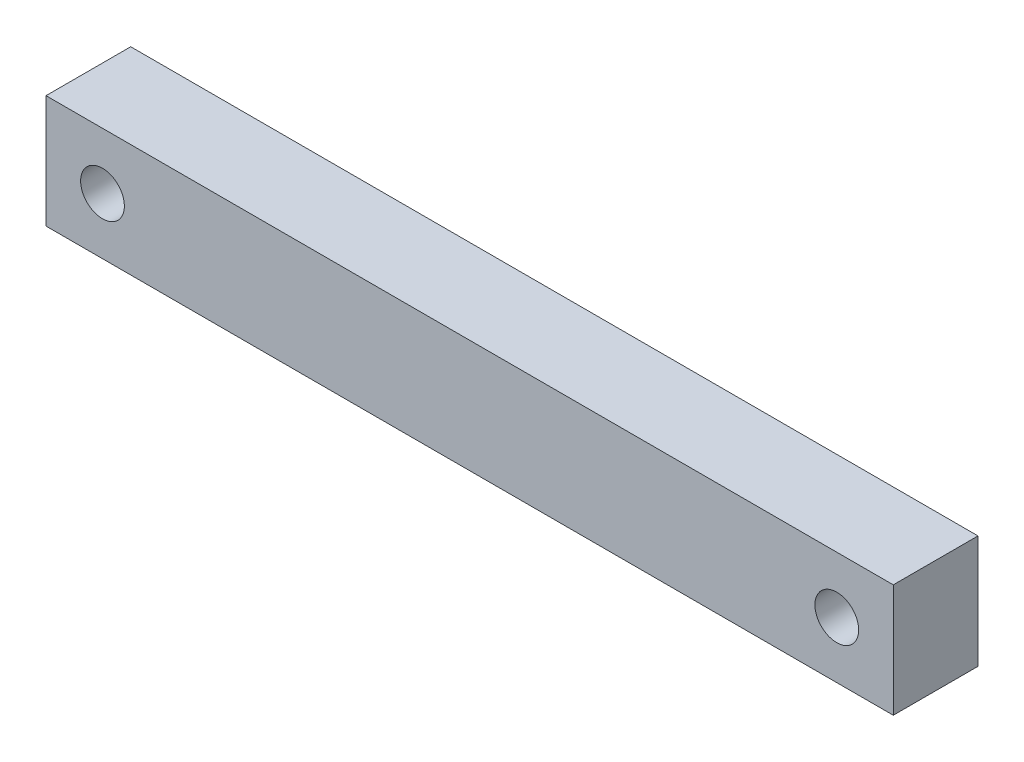
ISO-10303-21;
HEADER;
FILE_DESCRIPTION(('STEP AP214'),'2;1');
FILE_NAME('part.step','',(''),(''),'','','');
FILE_SCHEMA(('AUTOMOTIVE_DESIGN { 1 0 10303 214 1 1 1 1 }'));
ENDSEC;
DATA;
#1=APPLICATION_CONTEXT('core data for automotive mechanical design processes');
#2=APPLICATION_PROTOCOL_DEFINITION('international standard','automotive_design',2000,#1);
#3=PRODUCT_CONTEXT('',#1,'mechanical');
#4=PRODUCT('Part','Part','',(#3));
#5=PRODUCT_RELATED_PRODUCT_CATEGORY('part','',(#4));
#6=PRODUCT_DEFINITION_FORMATION('','',#4);
#7=PRODUCT_DEFINITION_CONTEXT('part definition',#1,'design');
#8=PRODUCT_DEFINITION('design','',#6,#7);
#9=PRODUCT_DEFINITION_SHAPE('','',#8);
#10=(LENGTH_UNIT() NAMED_UNIT(*) SI_UNIT(.MILLI.,.METRE.));
#11=(NAMED_UNIT(*) PLANE_ANGLE_UNIT() SI_UNIT($,.RADIAN.));
#12=(NAMED_UNIT(*) SI_UNIT($,.STERADIAN.) SOLID_ANGLE_UNIT());
#13=UNCERTAINTY_MEASURE_WITH_UNIT(LENGTH_MEASURE(1.E-05),#10,'distance_accuracy_value','');
#14=(GEOMETRIC_REPRESENTATION_CONTEXT(3) GLOBAL_UNCERTAINTY_ASSIGNED_CONTEXT((#13)) GLOBAL_UNIT_ASSIGNED_CONTEXT((#10,
#11,#12)) REPRESENTATION_CONTEXT('',''));
#15=CARTESIAN_POINT('',(0.,0.,0.));
#16=DIRECTION('',(0.,0.,1.));
#17=DIRECTION('',(1.,0.,0.));
#18=AXIS2_PLACEMENT_3D('',#15,#16,#17);
#19=CARTESIAN_POINT('',(0.,0.,6.));
#20=DIRECTION('',(0.,0.,-1.));
#21=DIRECTION('',(-1.,0.,0.));
#22=AXIS2_PLACEMENT_3D('',#19,#20,#21);
#23=PLANE('',#22);
#24=CARTESIAN_POINT('',(85.,-175.103962955716,6.));
#25=DIRECTION('',(0.,0.,1.));
#26=DIRECTION('',(1.,0.,0.));
#27=AXIS2_PLACEMENT_3D('',#24,#25,#26);
#28=CIRCLE('',#27,1.54999999999999);
#29=CARTESIAN_POINT('',(86.55,-175.103962955716,6.));
#30=VERTEX_POINT('',#29);
#31=EDGE_CURVE('E102',#30,#30,#28,.T.);
#32=ORIENTED_EDGE('',*,*,#31,.F.);
#33=EDGE_LOOP('',(#32));
#34=FACE_BOUND('',#33,.T.);
#35=DIRECTION('',(-1.,0.,0.));
#36=VECTOR('',#35,1.);
#37=CARTESIAN_POINT('',(28.9999999999999,-171.103962955716,6.));
#38=LINE('',#37,#36);
#39=CARTESIAN_POINT('',(89.,-171.103962955716,6.));
#40=VERTEX_POINT('',#39);
#41=CARTESIAN_POINT('',(28.9999999999999,-171.103962955716,6.));
#42=VERTEX_POINT('',#41);
#43=EDGE_CURVE('E87',#40,#42,#38,.T.);
#44=ORIENTED_EDGE('',*,*,#43,.T.);
#45=DIRECTION('',(0.,-1.,0.));
#46=VECTOR('',#45,1.);
#47=CARTESIAN_POINT('',(28.9999999999999,-171.103962955716,6.));
#48=LINE('',#47,#46);
#49=CARTESIAN_POINT('',(28.9999999999999,-179.103962955716,6.));
#50=VERTEX_POINT('',#49);
#51=EDGE_CURVE('E82',#42,#50,#48,.T.);
#52=ORIENTED_EDGE('',*,*,#51,.T.);
#53=DIRECTION('',(1.,0.,0.));
#54=VECTOR('',#53,1.);
#55=CARTESIAN_POINT('',(28.9999999999999,-179.103962955716,6.));
#56=LINE('',#55,#54);
#57=CARTESIAN_POINT('',(89.,-179.103962955716,6.));
#58=VERTEX_POINT('',#57);
#59=EDGE_CURVE('E85',#50,#58,#56,.T.);
#60=ORIENTED_EDGE('',*,*,#59,.T.);
#61=DIRECTION('',(0.,1.,0.));
#62=VECTOR('',#61,1.);
#63=CARTESIAN_POINT('',(89.,-171.103962955716,6.));
#64=LINE('',#63,#62);
#65=EDGE_CURVE('E52',#58,#40,#64,.T.);
#66=ORIENTED_EDGE('',*,*,#65,.T.);
#67=EDGE_LOOP('',(#44,#52,#60,#66));
#68=FACE_BOUND('',#67,.T.);
#69=CARTESIAN_POINT('',(32.9999999999999,-175.103962955716,6.));
#70=DIRECTION('',(0.,0.,1.));
#71=DIRECTION('',(1.,0.,0.));
#72=AXIS2_PLACEMENT_3D('',#69,#70,#71);
#73=CIRCLE('',#72,1.55);
#74=CARTESIAN_POINT('',(34.5499999999999,-175.103962955716,6.));
#75=VERTEX_POINT('',#74);
#76=EDGE_CURVE('E117',#75,#75,#73,.T.);
#77=ORIENTED_EDGE('',*,*,#76,.F.);
#78=EDGE_LOOP('',(#77));
#79=FACE_BOUND('',#78,.T.);
#80=ADVANCED_FACE('F35',(#34,#68,#79),#23,.F.);
#81=CARTESIAN_POINT('',(0.,0.,0.));
#82=DIRECTION('',(0.,0.,-1.));
#83=DIRECTION('',(-1.,0.,0.));
#84=AXIS2_PLACEMENT_3D('',#81,#82,#83);
#85=PLANE('',#84);
#86=CARTESIAN_POINT('',(85.,-175.103962955716,0.));
#87=DIRECTION('',(0.,0.,1.));
#88=DIRECTION('',(1.,0.,0.));
#89=AXIS2_PLACEMENT_3D('',#86,#87,#88);
#90=CIRCLE('',#89,1.54999999999999);
#91=CARTESIAN_POINT('',(86.55,-175.103962955716,0.));
#92=VERTEX_POINT('',#91);
#93=EDGE_CURVE('E114',#92,#92,#90,.T.);
#94=ORIENTED_EDGE('',*,*,#93,.T.);
#95=EDGE_LOOP('',(#94));
#96=FACE_BOUND('',#95,.T.);
#97=DIRECTION('',(-1.,0.,0.));
#98=VECTOR('',#97,1.);
#99=CARTESIAN_POINT('',(28.9999999999999,-171.103962955716,0.));
#100=LINE('',#99,#98);
#101=CARTESIAN_POINT('',(89.,-171.103962955716,0.));
#102=VERTEX_POINT('',#101);
#103=CARTESIAN_POINT('',(28.9999999999999,-171.103962955716,0.));
#104=VERTEX_POINT('',#103);
#105=EDGE_CURVE('E99',#102,#104,#100,.T.);
#106=ORIENTED_EDGE('',*,*,#105,.F.);
#107=DIRECTION('',(0.,1.,0.));
#108=VECTOR('',#107,1.);
#109=CARTESIAN_POINT('',(89.,-171.103962955716,0.));
#110=LINE('',#109,#108);
#111=CARTESIAN_POINT('',(89.,-179.103962955716,0.));
#112=VERTEX_POINT('',#111);
#113=EDGE_CURVE('E75',#112,#102,#110,.T.);
#114=ORIENTED_EDGE('',*,*,#113,.F.);
#115=DIRECTION('',(1.,0.,0.));
#116=VECTOR('',#115,1.);
#117=CARTESIAN_POINT('',(28.9999999999999,-179.103962955716,0.));
#118=LINE('',#117,#116);
#119=CARTESIAN_POINT('',(28.9999999999999,-179.103962955716,0.));
#120=VERTEX_POINT('',#119);
#121=EDGE_CURVE('E69',#120,#112,#118,.T.);
#122=ORIENTED_EDGE('',*,*,#121,.F.);
#123=DIRECTION('',(0.,-1.,0.));
#124=VECTOR('',#123,1.);
#125=CARTESIAN_POINT('',(28.9999999999999,-171.103962955716,0.));
#126=LINE('',#125,#124);
#127=EDGE_CURVE('E91',#104,#120,#126,.T.);
#128=ORIENTED_EDGE('',*,*,#127,.F.);
#129=EDGE_LOOP('',(#106,#114,#122,#128));
#130=FACE_BOUND('',#129,.T.);
#131=CARTESIAN_POINT('',(32.9999999999999,-175.103962955716,0.));
#132=DIRECTION('',(0.,0.,1.));
#133=DIRECTION('',(1.,0.,0.));
#134=AXIS2_PLACEMENT_3D('',#131,#132,#133);
#135=CIRCLE('',#134,1.55);
#136=CARTESIAN_POINT('',(34.5499999999999,-175.103962955716,0.));
#137=VERTEX_POINT('',#136);
#138=EDGE_CURVE('E120',#137,#137,#135,.T.);
#139=ORIENTED_EDGE('',*,*,#138,.T.);
#140=EDGE_LOOP('',(#139));
#141=FACE_BOUND('',#140,.T.);
#142=ADVANCED_FACE('F110',(#96,#130,#141),#85,.T.);
#143=CARTESIAN_POINT('',(28.9999999999999,-171.103962955716,6.));
#144=DIRECTION('',(0.,-1.,0.));
#145=DIRECTION('',(1.,0.,0.));
#146=AXIS2_PLACEMENT_3D('',#143,#144,#145);
#147=PLANE('',#146);
#148=ORIENTED_EDGE('',*,*,#105,.T.);
#149=DIRECTION('',(0.,0.,-1.));
#150=VECTOR('',#149,1.);
#151=CARTESIAN_POINT('',(28.9999999999999,-171.103962955716,6.));
#152=LINE('',#151,#150);
#153=EDGE_CURVE('E11',#42,#104,#152,.T.);
#154=ORIENTED_EDGE('',*,*,#153,.F.);
#155=ORIENTED_EDGE('',*,*,#43,.F.);
#156=DIRECTION('',(0.,0.,-1.));
#157=VECTOR('',#156,1.);
#158=CARTESIAN_POINT('',(89.,-171.103962955716,6.));
#159=LINE('',#158,#157);
#160=EDGE_CURVE('E95',#40,#102,#159,.T.);
#161=ORIENTED_EDGE('',*,*,#160,.T.);
#162=EDGE_LOOP('',(#148,#154,#155,#161));
#163=FACE_BOUND('',#162,.T.);
#164=ADVANCED_FACE('F37',(#163),#147,.F.);
#165=CARTESIAN_POINT('',(28.9999999999999,-171.103962955716,6.));
#166=DIRECTION('',(1.,0.,0.));
#167=DIRECTION('',(0.,0.,-1.));
#168=AXIS2_PLACEMENT_3D('',#165,#166,#167);
#169=PLANE('',#168);
#170=ORIENTED_EDGE('',*,*,#127,.T.);
#171=DIRECTION('',(0.,0.,-1.));
#172=VECTOR('',#171,1.);
#173=CARTESIAN_POINT('',(28.9999999999999,-179.103962955716,6.));
#174=LINE('',#173,#172);
#175=EDGE_CURVE('E44',#50,#120,#174,.T.);
#176=ORIENTED_EDGE('',*,*,#175,.F.);
#177=ORIENTED_EDGE('',*,*,#51,.F.);
#178=ORIENTED_EDGE('',*,*,#153,.T.);
#179=EDGE_LOOP('',(#170,#176,#177,#178));
#180=FACE_BOUND('',#179,.T.);
#181=ADVANCED_FACE('F90',(#180),#169,.F.);
#182=CARTESIAN_POINT('',(28.9999999999999,-179.103962955716,6.));
#183=DIRECTION('',(0.,1.,0.));
#184=DIRECTION('',(-1.,0.,0.));
#185=AXIS2_PLACEMENT_3D('',#182,#183,#184);
#186=PLANE('',#185);
#187=ORIENTED_EDGE('',*,*,#121,.T.);
#188=DIRECTION('',(0.,0.,-1.));
#189=VECTOR('',#188,1.);
#190=CARTESIAN_POINT('',(89.,-179.103962955716,6.));
#191=LINE('',#190,#189);
#192=EDGE_CURVE('E92',#58,#112,#191,.T.);
#193=ORIENTED_EDGE('',*,*,#192,.F.);
#194=ORIENTED_EDGE('',*,*,#59,.F.);
#195=ORIENTED_EDGE('',*,*,#175,.T.);
#196=EDGE_LOOP('',(#187,#193,#194,#195));
#197=FACE_BOUND('',#196,.T.);
#198=ADVANCED_FACE('F93',(#197),#186,.F.);
#199=CARTESIAN_POINT('',(89.,-171.103962955716,6.));
#200=DIRECTION('',(-1.,0.,0.));
#201=DIRECTION('',(0.,0.,1.));
#202=AXIS2_PLACEMENT_3D('',#199,#200,#201);
#203=PLANE('',#202);
#204=ORIENTED_EDGE('',*,*,#113,.T.);
#205=ORIENTED_EDGE('',*,*,#160,.F.);
#206=ORIENTED_EDGE('',*,*,#65,.F.);
#207=ORIENTED_EDGE('',*,*,#192,.T.);
#208=EDGE_LOOP('',(#204,#205,#206,#207));
#209=FACE_BOUND('',#208,.T.);
#210=ADVANCED_FACE('F107',(#209),#203,.F.);
#211=CARTESIAN_POINT('',(85.,-175.103962955716,6.));
#212=DIRECTION('',(0.,0.,-1.));
#213=DIRECTION('',(-1.,0.,0.));
#214=AXIS2_PLACEMENT_3D('',#211,#212,#213);
#215=CYLINDRICAL_SURFACE('',#214,1.54999999999999);
#216=ORIENTED_EDGE('',*,*,#31,.T.);
#217=EDGE_LOOP('',(#216));
#218=FACE_BOUND('',#217,.T.);
#219=ORIENTED_EDGE('',*,*,#93,.F.);
#220=EDGE_LOOP('',(#219));
#221=FACE_BOUND('',#220,.T.);
#222=ADVANCED_FACE('F138',(#218,#221),#215,.F.);
#223=CARTESIAN_POINT('',(32.9999999999999,-175.103962955716,6.));
#224=DIRECTION('',(0.,0.,-1.));
#225=DIRECTION('',(-1.,0.,0.));
#226=AXIS2_PLACEMENT_3D('',#223,#224,#225);
#227=CYLINDRICAL_SURFACE('',#226,1.55);
#228=ORIENTED_EDGE('',*,*,#76,.T.);
#229=EDGE_LOOP('',(#228));
#230=FACE_BOUND('',#229,.T.);
#231=ORIENTED_EDGE('',*,*,#138,.F.);
#232=EDGE_LOOP('',(#231));
#233=FACE_BOUND('',#232,.T.);
#234=ADVANCED_FACE('F126',(#230,#233),#227,.F.);
#235=CLOSED_SHELL('',(#80,#142,#164,#181,#198,#210,#222,#234));
#236=MANIFOLD_SOLID_BREP('B2',#235);
#237=ADVANCED_BREP_SHAPE_REPRESENTATION('',(#18,#236),#14);
#238=SHAPE_DEFINITION_REPRESENTATION(#9,#237);
ENDSEC;
END-ISO-10303-21;
